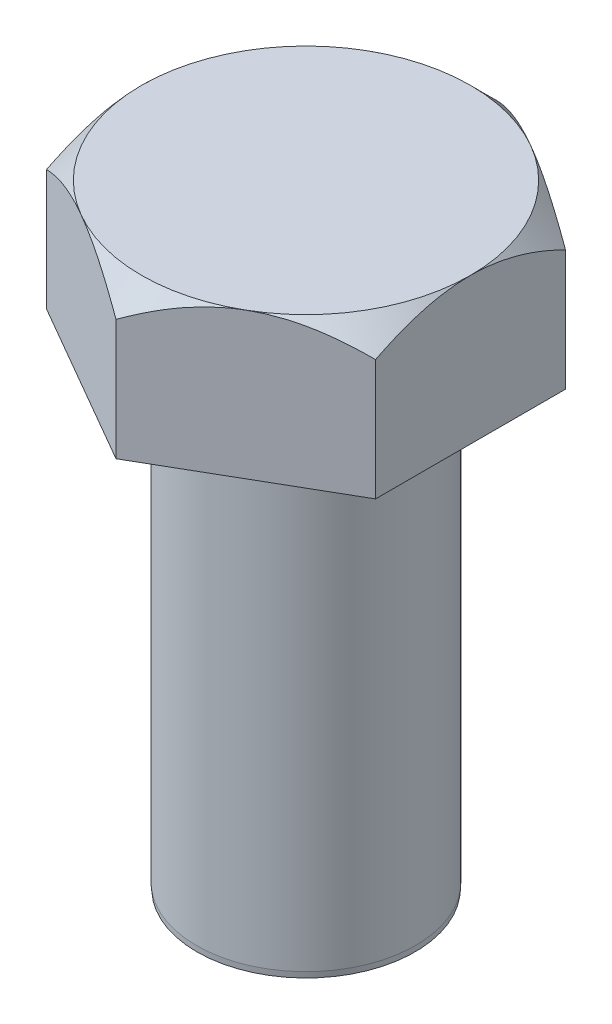
ISO-10303-21;
HEADER;
FILE_DESCRIPTION(('STEP AP214'),'2;1');
FILE_NAME('part.step','',(''),(''),'','','');
FILE_SCHEMA(('AUTOMOTIVE_DESIGN { 1 0 10303 214 1 1 1 1 }'));
ENDSEC;
DATA;
#1=APPLICATION_CONTEXT('core data for automotive mechanical design processes');
#2=APPLICATION_PROTOCOL_DEFINITION('international standard','automotive_design',2000,#1);
#3=PRODUCT_CONTEXT('',#1,'mechanical');
#4=PRODUCT('Part','Part','',(#3));
#5=PRODUCT_RELATED_PRODUCT_CATEGORY('part','',(#4));
#6=PRODUCT_DEFINITION_FORMATION('','',#4);
#7=PRODUCT_DEFINITION_CONTEXT('part definition',#1,'design');
#8=PRODUCT_DEFINITION('design','',#6,#7);
#9=PRODUCT_DEFINITION_SHAPE('','',#8);
#10=(LENGTH_UNIT() NAMED_UNIT(*) SI_UNIT(.MILLI.,.METRE.));
#11=(NAMED_UNIT(*) PLANE_ANGLE_UNIT() SI_UNIT($,.RADIAN.));
#12=(NAMED_UNIT(*) SI_UNIT($,.STERADIAN.) SOLID_ANGLE_UNIT());
#13=UNCERTAINTY_MEASURE_WITH_UNIT(LENGTH_MEASURE(1.E-05),#10,'distance_accuracy_value','');
#14=(GEOMETRIC_REPRESENTATION_CONTEXT(3) GLOBAL_UNCERTAINTY_ASSIGNED_CONTEXT((#13)) GLOBAL_UNIT_ASSIGNED_CONTEXT((#10,
#11,#12)) REPRESENTATION_CONTEXT('',''));
#15=CARTESIAN_POINT('',(0.,0.,0.));
#16=DIRECTION('',(0.,0.,1.));
#17=DIRECTION('',(1.,0.,0.));
#18=AXIS2_PLACEMENT_3D('',#15,#16,#17);
#19=CARTESIAN_POINT('',(7.15009999999996,6.35,-4.12811215973283));
#20=DIRECTION('',(-0.499999999999995,0.,0.866025403784441));
#21=DIRECTION('',(0.866025403784442,0.,0.499999999999995));
#22=AXIS2_PLACEMENT_3D('',#19,#20,#21);
#23=PLANE('',#22);
#24=CARTESIAN_POINT('',(7.15029999999996,5.24376020805829,-4.12799668967899));
#25=CARTESIAN_POINT('',(7.02735981479973,5.31473208114426,-4.19897623869856));
#26=CARTESIAN_POINT('',(6.90347465758507,5.38352591509957,-4.27050136756504));
#27=CARTESIAN_POINT('',(6.65362901516201,5.51609496244518,-4.41474981647385));
#28=CARTESIAN_POINT('',(6.52766744128796,5.57986743492815,-4.48747376505758));
#29=CARTESIAN_POINT('',(6.14521985336649,5.76320280111308,-4.70827998289497));
#30=CARTESIAN_POINT('',(5.88549626774101,5.87400155292641,-4.85823146497073));
#31=CARTESIAN_POINT('',(5.36174291484116,6.06373669034418,-5.16062060425642));
#32=CARTESIAN_POINT('',(5.09784700922402,6.14315107326227,-5.31298097640252));
#33=CARTESIAN_POINT('',(4.69766469893423,6.23501393674774,-5.54402634097325));
#34=CARTESIAN_POINT('',(4.56368142899528,6.26107948825729,-5.62138161793941));
#35=CARTESIAN_POINT('',(4.29458046497126,6.30353452510466,-5.77674713195786));
#36=CARTESIAN_POINT('',(4.15946294347778,6.319925456437,-5.85475726936435));
#37=CARTESIAN_POINT('',(3.83019852397778,6.34740730224126,-6.04485817059725));
#38=CARTESIAN_POINT('',(3.63569685436158,6.35317340265754,-6.15715376190799));
#39=CARTESIAN_POINT('',(3.24704409240871,6.34349459202812,-6.38154253864277));
#40=CARTESIAN_POINT('',(3.05289314684432,6.32804224579773,-6.49363563932778));
#41=CARTESIAN_POINT('',(2.66642169813378,6.27683739902505,-6.71676503427492));
#42=CARTESIAN_POINT('',(2.47410348685935,6.24106219749936,-6.82780000532428));
#43=CARTESIAN_POINT('',(2.09277255135678,6.15115660179108,-7.04796152358701));
#44=CARTESIAN_POINT('',(1.90375957482909,6.09702761510223,-7.15708821646561));
#45=CARTESIAN_POINT('',(1.56823093998172,5.98566881448239,-7.35080576411556));
#46=CARTESIAN_POINT('',(1.42097225552798,5.93136793728872,-7.43582560522543));
#47=CARTESIAN_POINT('',(1.12909829468736,5.81401595028394,-7.6043391150862));
#48=CARTESIAN_POINT('',(0.984483098549458,5.75096457532957,-7.68783273750533));
#49=CARTESIAN_POINT('',(0.6983516080155,5.61752492778284,-7.85303083058874));
#50=CARTESIAN_POINT('',(0.55682717595113,5.54715972840591,-7.93473999953801));
#51=CARTESIAN_POINT('',(0.276398890261677,5.40001620595466,-8.0966453457692));
#52=CARTESIAN_POINT('',(0.137493492810105,5.32324181558632,-8.17684241437976));
#53=CARTESIAN_POINT('',(-0.000199999999999894,5.24376020805829,-8.25633978951933));
#54=B_SPLINE_CURVE_WITH_KNOTS('',3,(#24,#25,#26,#27,#28,#29,#30,#31,#32,#33,#34,#35,#36,#37,#38,
#39,#40,#41,#42,#43,#44,#45,#46,#47,#48,#49,#50,#51,#52,#53),.UNSPECIFIED.,.F.,.F.,(4,2,2,2,2,2,
2,2,2,2,2,2,2,2,4),(0.,0.476107132166216,0.952472371030046,1.91034566100054,2.85300915505907,
3.32341643946382,3.7937533977268,4.46670173744884,5.13988594609707,5.81382359601269,
6.48770957546597,7.02295690652281,7.55822045931063,8.09184389327706,8.6251422671035),.UNSPECIFIED.);
#55=CARTESIAN_POINT('',(7.15009999999996,5.24387568053451,-4.12811215973283));
#56=VERTEX_POINT('',#55);
#57=CARTESIAN_POINT('',(3.57504999999996,6.35,-6.19216823959914));
#58=VERTEX_POINT('',#57);
#59=EDGE_CURVE('E105',#56,#58,#54,.T.);
#60=ORIENTED_EDGE('',*,*,#59,.F.);
#61=DIRECTION('',(0.,-1.,0.));
#62=VECTOR('',#61,1.);
#63=CARTESIAN_POINT('',(7.15009999999996,6.35,-4.12811215973283));
#64=LINE('',#63,#62);
#65=CARTESIAN_POINT('',(7.15009999999996,0.,-4.12811215973283));
#66=VERTEX_POINT('',#65);
#67=EDGE_CURVE('E272',#56,#66,#64,.T.);
#68=ORIENTED_EDGE('',*,*,#67,.T.);
#69=DIRECTION('',(-0.866025403784441,0.,-0.499999999999995));
#70=VECTOR('',#69,1.);
#71=CARTESIAN_POINT('',(7.15009999999996,0.,-4.12811215973283));
#72=LINE('',#71,#70);
#73=CARTESIAN_POINT('',(0.,0.,-8.25622431946549));
#74=VERTEX_POINT('',#73);
#75=EDGE_CURVE('E114',#66,#74,#72,.T.);
#76=ORIENTED_EDGE('',*,*,#75,.T.);
#77=DIRECTION('',(0.,-1.,0.));
#78=VECTOR('',#77,1.);
#79=CARTESIAN_POINT('',(0.,6.35,-8.25622431946549));
#80=LINE('',#79,#78);
#81=CARTESIAN_POINT('',(0.,5.24387568053451,-8.25622431946549));
#82=VERTEX_POINT('',#81);
#83=EDGE_CURVE('E132',#82,#74,#80,.T.);
#84=ORIENTED_EDGE('',*,*,#83,.F.);
#85=EDGE_CURVE('E115',#58,#82,#54,.T.);
#86=ORIENTED_EDGE('',*,*,#85,.F.);
#87=EDGE_LOOP('',(#60,#68,#76,#84,#86));
#88=FACE_BOUND('',#87,.T.);
#89=ADVANCED_FACE('F35',(#88),#23,.F.);
#90=CARTESIAN_POINT('',(0.,6.35,-8.25622431946549));
#91=DIRECTION('',(0.500000000000001,0.,0.866025403784438));
#92=DIRECTION('',(0.866025403784438,0.,-0.500000000000001));
#93=AXIS2_PLACEMENT_3D('',#90,#91,#92);
#94=PLANE('',#93);
#95=CARTESIAN_POINT('',(0.0002,5.24376020805829,-8.25633978951933));
#96=CARTESIAN_POINT('',(-0.122740185200222,5.31473208114426,-8.18536024049976));
#97=CARTESIAN_POINT('',(-0.246625342414885,5.38352591509958,-8.11383511163327));
#98=CARTESIAN_POINT('',(-0.496470984837945,5.51609496244519,-7.96958666272447));
#99=CARTESIAN_POINT('',(-0.622432558711996,5.57986743492816,-7.89686271414073));
#100=CARTESIAN_POINT('',(-1.00488014663348,5.76320280111309,-7.67605649630334));
#101=CARTESIAN_POINT('',(-1.26460373225895,5.87400155292642,-7.52610501422758));
#102=CARTESIAN_POINT('',(-1.78835708515881,6.06373669034419,-7.22371587494188));
#103=CARTESIAN_POINT('',(-2.05225299077595,6.1431510732623,-7.07135550279578));
#104=CARTESIAN_POINT('',(-2.45243530106574,6.23501393674777,-6.84031013822504));
#105=CARTESIAN_POINT('',(-2.58641857100469,6.26107948825732,-6.76295486125888));
#106=CARTESIAN_POINT('',(-2.85551953502872,6.30353452510469,-6.60758934724042));
#107=CARTESIAN_POINT('',(-2.99063705652219,6.31992545643702,-6.52957920983393));
#108=CARTESIAN_POINT('',(-3.3199014760222,6.34740730224129,-6.33947830860103));
#109=CARTESIAN_POINT('',(-3.51440314563839,6.35317340265757,-6.22718271729029));
#110=CARTESIAN_POINT('',(-3.90305590759126,6.34349459202815,-6.00279394055551));
#111=CARTESIAN_POINT('',(-4.09720685315564,6.32804224579776,-5.89070083987049));
#112=CARTESIAN_POINT('',(-4.48367830186619,6.27683739902508,-5.66757144492336));
#113=CARTESIAN_POINT('',(-4.67599651314062,6.24106219749939,-5.556536473874));
#114=CARTESIAN_POINT('',(-5.05732744864318,6.15115660179112,-5.33637495561126));
#115=CARTESIAN_POINT('',(-5.24634042517087,6.09702761510226,-5.22724826273266));
#116=CARTESIAN_POINT('',(-5.58186906001824,5.98566881448243,-5.03353071508271));
#117=CARTESIAN_POINT('',(-5.72912774447198,5.93136793728875,-4.94851087397283));
#118=CARTESIAN_POINT('',(-6.02100170531261,5.81401595028396,-4.77999736411205));
#119=CARTESIAN_POINT('',(-6.16561690145052,5.7509645753296,-4.69650374169292));
#120=CARTESIAN_POINT('',(-6.45174839198449,5.61752492778286,-4.5313056486095));
#121=CARTESIAN_POINT('',(-6.59327282404887,5.54715972840593,-4.44959647966022));
#122=CARTESIAN_POINT('',(-6.87370110973833,5.40001620595466,-4.28769113342903));
#123=CARTESIAN_POINT('',(-7.0126065071899,5.32324181558632,-4.20749406481847));
#124=CARTESIAN_POINT('',(-7.15030000000001,5.24376020805829,-4.12799668967889));
#125=B_SPLINE_CURVE_WITH_KNOTS('',3,(#95,#96,#97,#98,#99,#100,#101,#102,#103,#104,#105,#106,
#107,#108,#109,#110,#111,#112,#113,#114,#115,#116,#117,#118,#119,#120,#121,#122,#123,#124),
.UNSPECIFIED.,.F.,.F.,(4,2,2,2,2,2,2,2,2,2,2,2,2,2,4),(0.,0.476107132166221,0.952472371030056,
1.91034566100056,2.85300915505911,3.32341643946385,3.79375339772684,4.46670173744889,
5.13988594609711,5.81382359601273,6.48770957546601,7.02295690652286,7.55822045931071,
8.09184389327715,8.62514226710361),.UNSPECIFIED.);
#126=CARTESIAN_POINT('',(-3.57505000000001,6.35,-6.19216823959911));
#127=VERTEX_POINT('',#126);
#128=EDGE_CURVE('E122',#82,#127,#125,.T.);
#129=ORIENTED_EDGE('',*,*,#128,.F.);
#130=ORIENTED_EDGE('',*,*,#83,.T.);
#131=DIRECTION('',(-0.866025403784438,0.,0.500000000000001));
#132=VECTOR('',#131,1.);
#133=CARTESIAN_POINT('',(0.,0.,-8.25622431946549));
#134=LINE('',#133,#132);
#135=CARTESIAN_POINT('',(-7.15010000000001,0.,-4.12811215973273));
#136=VERTEX_POINT('',#135);
#137=EDGE_CURVE('E263',#74,#136,#134,.T.);
#138=ORIENTED_EDGE('',*,*,#137,.T.);
#139=DIRECTION('',(0.,-1.,0.));
#140=VECTOR('',#139,1.);
#141=CARTESIAN_POINT('',(-7.15010000000001,6.35,-4.12811215973273));
#142=LINE('',#141,#140);
#143=CARTESIAN_POINT('',(-7.15010000000001,5.24387568053451,-4.12811215973273));
#144=VERTEX_POINT('',#143);
#145=EDGE_CURVE('E205',#144,#136,#142,.T.);
#146=ORIENTED_EDGE('',*,*,#145,.F.);
#147=EDGE_CURVE('E133',#127,#144,#125,.T.);
#148=ORIENTED_EDGE('',*,*,#147,.F.);
#149=EDGE_LOOP('',(#129,#130,#138,#146,#148));
#150=FACE_BOUND('',#149,.T.);
#151=ADVANCED_FACE('F193',(#150),#94,.F.);
#152=CARTESIAN_POINT('',(-7.15010000000001,6.35,-4.12811215973273));
#153=DIRECTION('',(1.,0.,0.));
#154=DIRECTION('',(0.,0.,-1.));
#155=AXIS2_PLACEMENT_3D('',#152,#153,#154);
#156=PLANE('',#155);
#157=CARTESIAN_POINT('',(-7.15010000000003,1.63089085788719,-9.47386909605649));
#158=CARTESIAN_POINT('',(-7.15010000000003,1.81121581560539,-9.24790249070521));
#159=CARTESIAN_POINT('',(-7.15010000000003,1.99016418725543,-9.02082114931031));
#160=CARTESIAN_POINT('',(-7.15010000000003,2.34465316669975,-8.56394073706759));
#161=CARTESIAN_POINT('',(-7.15010000000003,2.5201930563962,-8.33414110959574));
#162=CARTESIAN_POINT('',(-7.15010000000003,2.868446395647,-7.86968034981608));
#163=CARTESIAN_POINT('',(-7.15010000000003,3.0411284373893,-7.63499559658916));
#164=CARTESIAN_POINT('',(-7.15010000000002,3.38131039804522,-7.16191403046406));
#165=CARTESIAN_POINT('',(-7.15010000000002,3.54881066036877,-6.92351746513816));
#166=CARTESIAN_POINT('',(-7.15010000000002,3.89019859321875,-6.42356671095031));
#167=CARTESIAN_POINT('',(-7.15010000000002,4.06356649358224,-6.16165586234294));
#168=CARTESIAN_POINT('',(-7.15010000000002,4.40077381694092,-5.63166319550724));
#169=CARTESIAN_POINT('',(-7.15010000000002,4.56461143837196,-5.36358022380933));
#170=CARTESIAN_POINT('',(-7.15010000000002,4.87937516438839,-4.82096243326766));
#171=CARTESIAN_POINT('',(-7.15010000000002,5.03033869234989,-4.54644949317194));
#172=CARTESIAN_POINT('',(-7.15010000000001,5.31597281014485,-3.98913965325442));
#173=CARTESIAN_POINT('',(-7.15010000000001,5.45065169434768,-3.70634706251455));
#174=CARTESIAN_POINT('',(-7.15010000000001,5.68224395499392,-3.16946720873966));
#175=CARTESIAN_POINT('',(-7.15010000000001,5.78179628197522,-2.91652981738955));
#176=CARTESIAN_POINT('',(-7.15010000000001,5.96068130805078,-2.40346766112692));
#177=CARTESIAN_POINT('',(-7.15010000000001,6.04001286165642,-2.14334248995796));
#178=CARTESIAN_POINT('',(-7.1501,6.17245096820923,-1.62248495464225));
#179=CARTESIAN_POINT('',(-7.1501,6.22609680418521,-1.36189223637387));
#180=CARTESIAN_POINT('',(-7.1501,6.30590762943054,-0.836507861915944));
#181=CARTESIAN_POINT('',(-7.1501,6.33208104018206,-0.571717517759924));
#182=CARTESIAN_POINT('',(-7.1501,6.35408284405149,-0.0577187353176461));
#183=CARTESIAN_POINT('',(-7.1501,6.35173239837544,0.19141159314656));
#184=CARTESIAN_POINT('',(-7.1501,6.32124800606946,0.688077635906895));
#185=CARTESIAN_POINT('',(-7.1501,6.29311214694111,0.935613230550542));
#186=CARTESIAN_POINT('',(-7.15009999999999,6.21229082442829,1.43154670462864));
#187=CARTESIAN_POINT('',(-7.15009999999999,6.15913527095504,1.6798664946589));
#188=CARTESIAN_POINT('',(-7.15009999999999,6.03147971556139,2.17085918647798));
#189=CARTESIAN_POINT('',(-7.15009999999999,5.9569795257941,2.4135320385497));
#190=CARTESIAN_POINT('',(-7.15009999999999,5.79048248965085,2.89215321636684));
#191=CARTESIAN_POINT('',(-7.15009999999999,5.69852189244993,3.12811432942166));
#192=CARTESIAN_POINT('',(-7.15009999999999,5.50032506783947,3.59401612680425));
#193=CARTESIAN_POINT('',(-7.15009999999999,5.39408271156479,3.8239541754974));
#194=CARTESIAN_POINT('',(-7.15009999999998,5.16984050461004,4.27885242834733));
#195=CARTESIAN_POINT('',(-7.15009999999998,5.05180562125056,4.50379521875785));
#196=CARTESIAN_POINT('',(-7.15009999999998,4.80656023664318,4.94854616944678));
#197=CARTESIAN_POINT('',(-7.15009999999998,4.67935108776111,5.168355080205));
#198=CARTESIAN_POINT('',(-7.15009999999998,4.42401096856745,5.59273981639913));
#199=CARTESIAN_POINT('',(-7.15009999999998,4.29623669089792,5.79753139755686));
#200=CARTESIAN_POINT('',(-7.15009999999998,4.03519862932643,6.20359582585859));
#201=CARTESIAN_POINT('',(-7.15009999999998,3.90193444245225,6.4048684131501));
#202=CARTESIAN_POINT('',(-7.15009999999998,3.63195773249821,6.80275896707806));
#203=CARTESIAN_POINT('',(-7.15009999999998,3.49528075722348,6.9994011408559));
#204=CARTESIAN_POINT('',(-7.15009999999997,3.21822330604325,7.38998078224734));
#205=CARTESIAN_POINT('',(-7.15009999999997,3.0778438588743,7.58391897874123));
#206=CARTESIAN_POINT('',(-7.15009999999997,2.93594735354651,7.77672110388246));
#207=B_SPLINE_CURVE_WITH_KNOTS('',3,(#157,#158,#159,#160,#161,#162,#163,#164,#165,#166,#167,
#168,#169,#170,#171,#172,#173,#174,#175,#176,#177,#178,#179,#180,#181,#182,#183,#184,#185,#186,
#187,#188,#189,#190,#191,#192,#193,#194,#195,#196,#197,#198,#199,#200,#201,#202,#203,#204,#205,
#206),.UNSPECIFIED.,.F.,.F.,(4,2,2,2,2,2,2,2,2,2,2,2,2,2,2,2,2,2,2,2,2,2,2,2,4),(0.,
0.867309176171177,1.73479913643537,2.60884845848508,3.48283973039317,4.42495432930787,
5.36724644671029,6.30669878036595,7.24567058249782,8.06046150623437,8.87529857688988,
9.67218308312768,10.4688232385201,11.214882925787,11.9609979526155,12.7217281313764,
13.4824650052708,14.2416394652586,15.0011407631884,15.7629695239043,16.524686213128,
17.248733545678,17.9728341200296,18.6912157430264,19.4093998229271),.UNSPECIFIED.);
#208=CARTESIAN_POINT('',(-7.1501,6.35,0.));
#209=VERTEX_POINT('',#208);
#210=EDGE_CURVE('E187',#144,#209,#207,.T.);
#211=ORIENTED_EDGE('',*,*,#210,.F.);
#212=ORIENTED_EDGE('',*,*,#145,.T.);
#213=DIRECTION('',(0.,0.,1.));
#214=VECTOR('',#213,1.);
#215=CARTESIAN_POINT('',(-7.15010000000001,0.,-4.12811215973273));
#216=LINE('',#215,#214);
#217=CARTESIAN_POINT('',(-7.15009999999999,0.,4.12811215973278));
#218=VERTEX_POINT('',#217);
#219=EDGE_CURVE('E222',#136,#218,#216,.T.);
#220=ORIENTED_EDGE('',*,*,#219,.T.);
#221=DIRECTION('',(0.,-1.,0.));
#222=VECTOR('',#221,1.);
#223=CARTESIAN_POINT('',(-7.15009999999999,6.35,4.12811215973278));
#224=LINE('',#223,#222);
#225=CARTESIAN_POINT('',(-7.15009999999999,5.24387568053451,4.12811215973278));
#226=VERTEX_POINT('',#225);
#227=EDGE_CURVE('E220',#226,#218,#224,.T.);
#228=ORIENTED_EDGE('',*,*,#227,.F.);
#229=EDGE_CURVE('E181',#209,#226,#207,.T.);
#230=ORIENTED_EDGE('',*,*,#229,.F.);
#231=EDGE_LOOP('',(#211,#212,#220,#228,#230));
#232=FACE_BOUND('',#231,.T.);
#233=ADVANCED_FACE('F189',(#232),#156,.F.);
#234=CARTESIAN_POINT('',(-7.15009999999999,6.35,4.12811215973278));
#235=DIRECTION('',(0.499999999999995,0.,-0.866025403784441));
#236=DIRECTION('',(-0.866025403784441,0.,-0.499999999999995));
#237=AXIS2_PLACEMENT_3D('',#234,#235,#236);
#238=PLANE('',#237);
#239=CARTESIAN_POINT('',(-7.15029999999998,5.24376020805829,4.12799668967894));
#240=CARTESIAN_POINT('',(-7.02735981479976,5.31473208114426,4.19897623869851));
#241=CARTESIAN_POINT('',(-6.9034746575851,5.38352591509958,4.27050136756499));
#242=CARTESIAN_POINT('',(-6.65362901516204,5.51609496244519,4.4147498164738));
#243=CARTESIAN_POINT('',(-6.52766744128798,5.57986743492816,4.48747376505753));
#244=CARTESIAN_POINT('',(-6.1452198533665,5.76320280111309,4.70827998289492));
#245=CARTESIAN_POINT('',(-5.88549626774103,5.87400155292642,4.85823146497068));
#246=CARTESIAN_POINT('',(-5.36174291484117,6.06373669034419,5.16062060425638));
#247=CARTESIAN_POINT('',(-5.09784700922402,6.1431510732623,5.31298097640248));
#248=CARTESIAN_POINT('',(-4.69766469893423,6.23501393674777,5.54402634097321));
#249=CARTESIAN_POINT('',(-4.56368142899528,6.26107948825732,5.62138161793937));
#250=CARTESIAN_POINT('',(-4.29458046497126,6.30353452510469,5.77674713195783));
#251=CARTESIAN_POINT('',(-4.15946294347778,6.31992545643702,5.85475726936432));
#252=CARTESIAN_POINT('',(-3.83019852397777,6.34740730224129,6.04485817059721));
#253=CARTESIAN_POINT('',(-3.63569685436158,6.35317340265757,6.15715376190795));
#254=CARTESIAN_POINT('',(-3.24704409240871,6.34349459202815,6.38154253864273));
#255=CARTESIAN_POINT('',(-3.05289314684433,6.32804224579776,6.49363563932775));
#256=CARTESIAN_POINT('',(-2.66642169813378,6.27683739902508,6.71676503427488));
#257=CARTESIAN_POINT('',(-2.47410348685935,6.24106219749939,6.82780000532424));
#258=CARTESIAN_POINT('',(-2.09277255135678,6.15115660179112,7.04796152358698));
#259=CARTESIAN_POINT('',(-1.90375957482909,6.09702761510226,7.15708821646557));
#260=CARTESIAN_POINT('',(-1.56823093998172,5.98566881448243,7.35080576411552));
#261=CARTESIAN_POINT('',(-1.42097225552798,5.93136793728875,7.4358256052254));
#262=CARTESIAN_POINT('',(-1.12909829468735,5.81401595028396,7.60433911508618));
#263=CARTESIAN_POINT('',(-0.984483098549436,5.7509645753296,7.68783273750531));
#264=CARTESIAN_POINT('',(-0.698351608015466,5.61752492778286,7.85303083058873));
#265=CARTESIAN_POINT('',(-0.556827175951092,5.54715972840593,7.934739999538));
#266=CARTESIAN_POINT('',(-0.276398890261629,5.40001620595466,8.0966453457692));
#267=CARTESIAN_POINT('',(-0.137493492810052,5.32324181558632,8.17684241437975));
#268=CARTESIAN_POINT('',(0.000200000000057124,5.24376020805829,8.25633978951933));
#269=B_SPLINE_CURVE_WITH_KNOTS('',3,(#239,#240,#241,#242,#243,#244,#245,#246,#247,#248,#249,
#250,#251,#252,#253,#254,#255,#256,#257,#258,#259,#260,#261,#262,#263,#264,#265,#266,#267,#268),
.UNSPECIFIED.,.F.,.F.,(4,2,2,2,2,2,2,2,2,2,2,2,2,2,4),(0.,0.476107132166221,0.952472371030058,
1.91034566100057,2.85300915505911,3.32341643946385,3.79375339772684,4.46670173744888,
5.13988594609711,5.81382359601273,6.48770957546601,7.02295690652286,7.55822045931071,
8.09184389327715,8.62514226710361),.UNSPECIFIED.);
#270=CARTESIAN_POINT('',(-3.57504999999996,6.35,6.19216823959913));
#271=VERTEX_POINT('',#270);
#272=EDGE_CURVE('E188',#226,#271,#269,.T.);
#273=ORIENTED_EDGE('',*,*,#272,.F.);
#274=ORIENTED_EDGE('',*,*,#227,.T.);
#275=DIRECTION('',(0.866025403784441,0.,0.499999999999995));
#276=VECTOR('',#275,1.);
#277=CARTESIAN_POINT('',(-7.15009999999999,0.,4.12811215973278));
#278=LINE('',#277,#276);
#279=CARTESIAN_POINT('',(0.,0.,8.25622431946549));
#280=VERTEX_POINT('',#279);
#281=EDGE_CURVE('E264',#218,#280,#278,.T.);
#282=ORIENTED_EDGE('',*,*,#281,.T.);
#283=DIRECTION('',(0.,-1.,0.));
#284=VECTOR('',#283,1.);
#285=CARTESIAN_POINT('',(0.,6.35,8.25622431946549));
#286=LINE('',#285,#284);
#287=CARTESIAN_POINT('',(0.,5.24387568053451,8.25622431946549));
#288=VERTEX_POINT('',#287);
#289=EDGE_CURVE('E226',#288,#280,#286,.T.);
#290=ORIENTED_EDGE('',*,*,#289,.F.);
#291=EDGE_CURVE('E175',#271,#288,#269,.T.);
#292=ORIENTED_EDGE('',*,*,#291,.F.);
#293=EDGE_LOOP('',(#273,#274,#282,#290,#292));
#294=FACE_BOUND('',#293,.T.);
#295=ADVANCED_FACE('F192',(#294),#238,.F.);
#296=CARTESIAN_POINT('',(0.,6.35,8.25622431946549));
#297=DIRECTION('',(-0.500000000000007,0.,-0.866025403784435));
#298=DIRECTION('',(-0.866025403784435,0.,0.500000000000007));
#299=AXIS2_PLACEMENT_3D('',#296,#297,#298);
#300=PLANE('',#299);
#301=CARTESIAN_POINT('',(-0.000199999999942347,5.24376020805829,8.25633978951933));
#302=CARTESIAN_POINT('',(0.122740185200279,5.31473208114426,8.18536024049976));
#303=CARTESIAN_POINT('',(0.246625342414941,5.38352591509958,8.11383511163327));
#304=CARTESIAN_POINT('',(0.496470984838001,5.51609496244519,7.96958666272446));
#305=CARTESIAN_POINT('',(0.622432558712051,5.57986743492816,7.89686271414073));
#306=CARTESIAN_POINT('',(1.00488014663353,5.76320280111309,7.67605649630334));
#307=CARTESIAN_POINT('',(1.264603732259,5.87400155292642,7.52610501422757));
#308=CARTESIAN_POINT('',(1.78835708515886,6.06373669034419,7.22371587494186));
#309=CARTESIAN_POINT('',(2.052252990776,6.1431510732623,7.07135550279576));
#310=CARTESIAN_POINT('',(2.45243530106579,6.23501393674777,6.84031013822502));
#311=CARTESIAN_POINT('',(2.58641857100474,6.26107948825731,6.76295486125886));
#312=CARTESIAN_POINT('',(2.85551953502876,6.30353452510469,6.6075893472404));
#313=CARTESIAN_POINT('',(2.99063705652223,6.31992545643702,6.52957920983391));
#314=CARTESIAN_POINT('',(3.31990147602224,6.34740730224129,6.33947830860101));
#315=CARTESIAN_POINT('',(3.51440314563843,6.35317340265757,6.22718271729027));
#316=CARTESIAN_POINT('',(3.9030559075913,6.34349459202815,6.00279394055549));
#317=CARTESIAN_POINT('',(4.09720685315568,6.32804224579776,5.89070083987047));
#318=CARTESIAN_POINT('',(4.48367830186623,6.27683739902508,5.66757144492333));
#319=CARTESIAN_POINT('',(4.67599651314065,6.24106219749939,5.55653647387397));
#320=CARTESIAN_POINT('',(5.05732744864322,6.15115660179112,5.33637495561122));
#321=CARTESIAN_POINT('',(5.24634042517091,6.09702761510226,5.22724826273263));
#322=CARTESIAN_POINT('',(5.58186906001828,5.98566881448243,5.03353071508267));
#323=CARTESIAN_POINT('',(5.72912774447202,5.93136793728875,4.94851087397279));
#324=CARTESIAN_POINT('',(6.02100170531265,5.81401595028396,4.77999736411201));
#325=CARTESIAN_POINT('',(6.16561690145056,5.7509645753296,4.69650374169287));
#326=CARTESIAN_POINT('',(6.45174839198452,5.61752492778285,4.53130564860946));
#327=CARTESIAN_POINT('',(6.5932728240489,5.54715972840592,4.44959647966018));
#328=CARTESIAN_POINT('',(6.87370110973836,5.40001620595466,4.28769113342898));
#329=CARTESIAN_POINT('',(7.01260650718993,5.32324181558632,4.20749406481842));
#330=CARTESIAN_POINT('',(7.15030000000004,5.24376020805829,4.12799668967884));
#331=B_SPLINE_CURVE_WITH_KNOTS('',3,(#301,#302,#303,#304,#305,#306,#307,#308,#309,#310,#311,
#312,#313,#314,#315,#316,#317,#318,#319,#320,#321,#322,#323,#324,#325,#326,#327,#328,#329,#330),
.UNSPECIFIED.,.F.,.F.,(4,2,2,2,2,2,2,2,2,2,2,2,2,2,4),(0.,0.476107132166222,0.952472371030056,
1.91034566100056,2.8530091550591,3.32341643946385,3.79375339772684,4.46670173744888,
5.13988594609711,5.81382359601273,6.48770957546601,7.02295690652286,7.55822045931071,
8.09184389327715,8.62514226710361),.UNSPECIFIED.);
#332=CARTESIAN_POINT('',(3.57505000000005,6.35,6.19216823959909));
#333=VERTEX_POINT('',#332);
#334=EDGE_CURVE('E283',#288,#333,#331,.T.);
#335=ORIENTED_EDGE('',*,*,#334,.F.);
#336=ORIENTED_EDGE('',*,*,#289,.T.);
#337=DIRECTION('',(0.866025403784435,0.,-0.500000000000007));
#338=VECTOR('',#337,1.);
#339=CARTESIAN_POINT('',(0.,0.,8.25622431946549));
#340=LINE('',#339,#338);
#341=CARTESIAN_POINT('',(7.15010000000004,0.,4.12811215973268));
#342=VERTEX_POINT('',#341);
#343=EDGE_CURVE('E268',#280,#342,#340,.T.);
#344=ORIENTED_EDGE('',*,*,#343,.T.);
#345=DIRECTION('',(0.,-1.,0.));
#346=VECTOR('',#345,1.);
#347=CARTESIAN_POINT('',(7.15010000000004,6.35,4.12811215973268));
#348=LINE('',#347,#346);
#349=CARTESIAN_POINT('',(7.15010000000004,5.24387568053451,4.12811215973268));
#350=VERTEX_POINT('',#349);
#351=EDGE_CURVE('E229',#350,#342,#348,.T.);
#352=ORIENTED_EDGE('',*,*,#351,.F.);
#353=EDGE_CURVE('E168',#333,#350,#331,.T.);
#354=ORIENTED_EDGE('',*,*,#353,.F.);
#355=EDGE_LOOP('',(#335,#336,#344,#352,#354));
#356=FACE_BOUND('',#355,.T.);
#357=ADVANCED_FACE('F280',(#356),#300,.F.);
#358=CARTESIAN_POINT('',(7.15010000000004,6.35,4.12811215973268));
#359=DIRECTION('',(-1.,0.,0.));
#360=DIRECTION('',(0.,0.,1.));
#361=AXIS2_PLACEMENT_3D('',#358,#359,#360);
#362=PLANE('',#361);
#363=CARTESIAN_POINT('',(7.1500999999999,1.63089084568141,-9.47386911134843));
#364=CARTESIAN_POINT('',(7.1500999999999,1.8112158038748,-9.24790250553399));
#365=CARTESIAN_POINT('',(7.15009999999991,1.9901641759994,-9.02082116367475));
#366=CARTESIAN_POINT('',(7.15009999999991,2.34465315639033,-8.56394075049952));
#367=CARTESIAN_POINT('',(7.15009999999991,2.52019304655884,-8.33414112255949));
#368=CARTESIAN_POINT('',(7.15009999999992,2.86844638675769,-7.86968036182892));
#369=CARTESIAN_POINT('',(7.15009999999992,3.04112842897584,-7.63499560811917));
#370=CARTESIAN_POINT('',(7.15009999999992,3.38131039057672,-7.16191404102097));
#371=CARTESIAN_POINT('',(7.15009999999993,3.54881065336935,-6.92351747520483));
#372=CARTESIAN_POINT('',(7.15009999999993,3.89019858720553,-6.42356671995492));
#373=CARTESIAN_POINT('',(7.15009999999994,4.06356648808435,-6.16165587077427));
#374=CARTESIAN_POINT('',(7.15009999999994,4.40077381245204,-5.63166320277258));
#375=CARTESIAN_POINT('',(7.15009999999994,4.56461143437675,-5.36358023048195));
#376=CARTESIAN_POINT('',(7.15009999999995,4.87937516134173,-4.82096243873408));
#377=CARTESIAN_POINT('',(7.15009999999995,5.03033868975839,-4.54644949802505));
#378=CARTESIAN_POINT('',(7.15009999999996,5.31597280840798,-3.98913965684663));
#379=CARTESIAN_POINT('',(7.15009999999996,5.45065169301035,-3.7063470654592));
#380=CARTESIAN_POINT('',(7.15009999999997,5.68224395389446,-3.16946721142345));
#381=CARTESIAN_POINT('',(7.15009999999997,5.7817962807887,-2.91652982049303));
#382=CARTESIAN_POINT('',(7.15009999999997,5.96068130677324,-2.40346766509055));
#383=CARTESIAN_POINT('',(7.15009999999998,6.04001286037489,-2.14334249436203));
#384=CARTESIAN_POINT('',(7.15009999999998,6.17245096702639,-1.62248495991549));
#385=CARTESIAN_POINT('',(7.15009999999999,6.22609680310152,-1.36189224207524));
#386=CARTESIAN_POINT('',(7.15009999999999,6.30590762865255,-0.836507868466953));
#387=CARTESIAN_POINT('',(7.15009999999999,6.33208103961055,-0.571717524732427));
#388=CARTESIAN_POINT('',(7.1501,6.35408284398224,-0.057718742911977));
#389=CARTESIAN_POINT('',(7.1501,6.35173239857837,0.191411585350977));
#390=CARTESIAN_POINT('',(7.15010000000001,6.32124800684642,0.688077627739453));
#391=CARTESIAN_POINT('',(7.15010000000001,6.29311214801996,0.935613222212498));
#392=CARTESIAN_POINT('',(7.15010000000001,6.2122908261277,1.43154669595436));
#393=CARTESIAN_POINT('',(7.15010000000002,6.15913527297532,1.67986648581989));
#394=CARTESIAN_POINT('',(7.15010000000002,6.03147971821725,2.17085917733268));
#395=CARTESIAN_POINT('',(7.15010000000002,5.95697952876465,2.41353202926283));
#396=CARTESIAN_POINT('',(7.15010000000003,5.79048249349503,2.89215320606262));
#397=CARTESIAN_POINT('',(7.15010000000003,5.69852189690814,3.12811431826103));
#398=CARTESIAN_POINT('',(7.15010000000004,5.50032507358712,3.59401611397431));
#399=CARTESIAN_POINT('',(7.15010000000004,5.39408271798793,3.82395416185457));
#400=CARTESIAN_POINT('',(7.15010000000004,5.16984051242519,4.27885241310805));
#401=CARTESIAN_POINT('',(7.15010000000005,5.05180562978249,4.50379520273518));
#402=CARTESIAN_POINT('',(7.15010000000005,4.80656024663132,4.94854615188308));
#403=CARTESIAN_POINT('',(7.15010000000005,4.67935109848869,5.16835506188367));
#404=CARTESIAN_POINT('',(7.15010000000006,4.42401098069604,5.59273979670796));
#405=CARTESIAN_POINT('',(7.15010000000006,4.29623670368454,5.79753137725083));
#406=CARTESIAN_POINT('',(7.15010000000007,4.03519864343176,6.20359580433172));
#407=CARTESIAN_POINT('',(7.15010000000007,3.90193445721827,6.40486839101724));
#408=CARTESIAN_POINT('',(7.15010000000007,3.63195774857802,6.80275894374802));
#409=CARTESIAN_POINT('',(7.15010000000007,3.49528077395631,6.99940111693457));
#410=CARTESIAN_POINT('',(7.15010000000008,3.21822332408119,7.38998075714733));
#411=CARTESIAN_POINT('',(7.15010000000008,3.07784387756432,7.58391895305384));
#412=CARTESIAN_POINT('',(7.15010000000008,2.93594737288767,7.7767210776087));
#413=B_SPLINE_CURVE_WITH_KNOTS('',3,(#363,#364,#365,#366,#367,#368,#369,#370,#371,#372,#373,
#374,#375,#376,#377,#378,#379,#380,#381,#382,#383,#384,#385,#386,#387,#388,#389,#390,#391,#392,
#393,#394,#395,#396,#397,#398,#399,#400,#401,#402,#403,#404,#405,#406,#407,#408,#409,#410,#411,
#412),.UNSPECIFIED.,.F.,.F.,(4,2,2,2,2,2,2,2,2,2,2,2,2,2,2,2,2,2,2,2,2,2,2,2,4),(0.,
0.867309178146457,1.7347991403865,2.60884846444894,3.4828397383694,4.42495433957124,
5.36724645926233,6.30669879518682,7.24567059958342,8.06046152205712,8.87529859145194,
9.67218309649984,10.468823250704,11.2148829373626,11.9609979635813,12.7217281416573,
13.4824650148672,14.2416394717964,15.001140766664,15.7629695243005,16.524686210446,
17.248733540386,17.9728341121274,18.6912157325493,19.4093998098754),.UNSPECIFIED.);
#414=CARTESIAN_POINT('',(7.1501,6.35,0.));
#415=VERTEX_POINT('',#414);
#416=EDGE_CURVE('E276',#350,#415,#413,.F.);
#417=ORIENTED_EDGE('',*,*,#416,.F.);
#418=ORIENTED_EDGE('',*,*,#351,.T.);
#419=DIRECTION('',(0.,0.,-1.));
#420=VECTOR('',#419,1.);
#421=CARTESIAN_POINT('',(7.15010000000004,0.,4.12811215973268));
#422=LINE('',#421,#420);
#423=EDGE_CURVE('E262',#342,#66,#422,.T.);
#424=ORIENTED_EDGE('',*,*,#423,.T.);
#425=ORIENTED_EDGE('',*,*,#67,.F.);
#426=EDGE_CURVE('E110',#415,#56,#413,.F.);
#427=ORIENTED_EDGE('',*,*,#426,.F.);
#428=EDGE_LOOP('',(#417,#418,#424,#425,#427));
#429=FACE_BOUND('',#428,.T.);
#430=ADVANCED_FACE('F256',(#429),#362,.F.);
#431=CARTESIAN_POINT('',(0.,0.,0.));
#432=DIRECTION('',(0.,1.,0.));
#433=DIRECTION('',(0.,0.,1.));
#434=AXIS2_PLACEMENT_3D('',#431,#432,#433);
#435=PLANE('',#434);
#436=CARTESIAN_POINT('',(0.,0.,0.));
#437=DIRECTION('',(0.,1.,0.));
#438=DIRECTION('',(0.,0.,1.));
#439=AXIS2_PLACEMENT_3D('',#436,#437,#438);
#440=CIRCLE('',#439,4.7625);
#441=CARTESIAN_POINT('',(0.,0.,4.7625));
#442=VERTEX_POINT('',#441);
#443=EDGE_CURVE('E234',#442,#442,#440,.F.);
#444=ORIENTED_EDGE('',*,*,#443,.F.);
#445=EDGE_LOOP('',(#444));
#446=FACE_BOUND('',#445,.T.);
#447=ORIENTED_EDGE('',*,*,#75,.F.);
#448=ORIENTED_EDGE('',*,*,#423,.F.);
#449=ORIENTED_EDGE('',*,*,#343,.F.);
#450=ORIENTED_EDGE('',*,*,#281,.F.);
#451=ORIENTED_EDGE('',*,*,#219,.F.);
#452=ORIENTED_EDGE('',*,*,#137,.F.);
#453=EDGE_LOOP('',(#447,#448,#449,#450,#451,#452));
#454=FACE_BOUND('',#453,.T.);
#455=ADVANCED_FACE('F251',(#446,#454),#435,.F.);
#456=CARTESIAN_POINT('',(0.,-20.32,0.));
#457=DIRECTION('',(0.,1.,0.));
#458=DIRECTION('',(0.,0.,1.));
#459=AXIS2_PLACEMENT_3D('',#456,#457,#458);
#460=CYLINDRICAL_SURFACE('',#459,4.7625);
#461=CARTESIAN_POINT('',(0.,-20.0660000000002,0.));
#462=DIRECTION('',(0.,-1.,0.));
#463=DIRECTION('',(0.,0.,-1.));
#464=AXIS2_PLACEMENT_3D('',#461,#462,#463);
#465=CIRCLE('',#464,4.7625);
#466=CARTESIAN_POINT('',(0.,-20.0660000000002,-4.7625));
#467=VERTEX_POINT('',#466);
#468=EDGE_CURVE('E12',#467,#467,#465,.F.);
#469=ORIENTED_EDGE('',*,*,#468,.T.);
#470=EDGE_LOOP('',(#469));
#471=FACE_BOUND('',#470,.T.);
#472=ORIENTED_EDGE('',*,*,#443,.T.);
#473=EDGE_LOOP('',(#472));
#474=FACE_BOUND('',#473,.T.);
#475=ADVANCED_FACE('F248',(#471,#474),#460,.T.);
#476=CARTESIAN_POINT('',(0.,-20.32,0.));
#477=DIRECTION('',(0.,-1.,0.));
#478=DIRECTION('',(0.,0.,-1.));
#479=AXIS2_PLACEMENT_3D('',#476,#477,#478);
#480=PLANE('',#479);
#481=CARTESIAN_POINT('',(0.,-20.32,0.));
#482=DIRECTION('',(0.,-1.,0.));
#483=DIRECTION('',(0.,0.,-1.));
#484=AXIS2_PLACEMENT_3D('',#481,#482,#483);
#485=CIRCLE('',#484,4.74027787946443);
#486=CARTESIAN_POINT('',(0.,-20.32,-4.74027787946443));
#487=VERTEX_POINT('',#486);
#488=EDGE_CURVE('E43',#487,#487,#485,.T.);
#489=ORIENTED_EDGE('',*,*,#488,.T.);
#490=EDGE_LOOP('',(#489));
#491=FACE_BOUND('',#490,.T.);
#492=ADVANCED_FACE('F153',(#491),#480,.T.);
#493=CARTESIAN_POINT('',(0.,6.35,0.));
#494=DIRECTION('',(0.,-1.,0.));
#495=DIRECTION('',(0.,0.,1.));
#496=AXIS2_PLACEMENT_3D('',#493,#494,#495);
#497=CONICAL_SURFACE('',#496,7.1501,0.78539816339745);
#498=ORIENTED_EDGE('',*,*,#291,.T.);
#499=ORIENTED_EDGE('',*,*,#334,.T.);
#500=CARTESIAN_POINT('',(0.,6.35,0.));
#501=DIRECTION('',(0.,1.,0.));
#502=DIRECTION('',(0.,0.,1.));
#503=AXIS2_PLACEMENT_3D('',#500,#501,#502);
#504=CIRCLE('',#503,7.1501);
#505=EDGE_CURVE('E129',#271,#333,#504,.T.);
#506=ORIENTED_EDGE('',*,*,#505,.F.);
#507=EDGE_LOOP('',(#498,#499,#506));
#508=FACE_BOUND('',#507,.T.);
#509=ADVANCED_FACE('F285',(#508),#497,.T.);
#510=ORIENTED_EDGE('',*,*,#229,.T.);
#511=ORIENTED_EDGE('',*,*,#272,.T.);
#512=EDGE_CURVE('E213',#209,#271,#504,.T.);
#513=ORIENTED_EDGE('',*,*,#512,.F.);
#514=EDGE_LOOP('',(#510,#511,#513));
#515=FACE_BOUND('',#514,.T.);
#516=ADVANCED_FACE('F214',(#515),#497,.T.);
#517=ORIENTED_EDGE('',*,*,#147,.T.);
#518=ORIENTED_EDGE('',*,*,#210,.T.);
#519=EDGE_CURVE('E126',#127,#209,#504,.T.);
#520=ORIENTED_EDGE('',*,*,#519,.F.);
#521=EDGE_LOOP('',(#517,#518,#520));
#522=FACE_BOUND('',#521,.T.);
#523=ADVANCED_FACE('F209',(#522),#497,.T.);
#524=ORIENTED_EDGE('',*,*,#85,.T.);
#525=ORIENTED_EDGE('',*,*,#128,.T.);
#526=EDGE_CURVE('E119',#58,#127,#504,.T.);
#527=ORIENTED_EDGE('',*,*,#526,.F.);
#528=EDGE_LOOP('',(#524,#525,#527));
#529=FACE_BOUND('',#528,.T.);
#530=ADVANCED_FACE('F120',(#529),#497,.T.);
#531=ORIENTED_EDGE('',*,*,#59,.T.);
#532=EDGE_CURVE('E108',#415,#58,#504,.T.);
#533=ORIENTED_EDGE('',*,*,#532,.F.);
#534=ORIENTED_EDGE('',*,*,#426,.T.);
#535=EDGE_LOOP('',(#531,#533,#534));
#536=FACE_BOUND('',#535,.T.);
#537=ADVANCED_FACE('F107',(#536),#497,.T.);
#538=ORIENTED_EDGE('',*,*,#353,.T.);
#539=ORIENTED_EDGE('',*,*,#416,.T.);
#540=CARTESIAN_POINT('',(0.,6.35,0.));
#541=DIRECTION('',(0.,1.,0.));
#542=DIRECTION('',(0.,0.,1.));
#543=AXIS2_PLACEMENT_3D('',#540,#541,#542);
#544=CIRCLE('',#543,7.1501);
#545=EDGE_CURVE('E50',#333,#415,#544,.T.);
#546=ORIENTED_EDGE('',*,*,#545,.F.);
#547=EDGE_LOOP('',(#538,#539,#546));
#548=FACE_BOUND('',#547,.T.);
#549=ADVANCED_FACE('F152',(#548),#497,.T.);
#550=CARTESIAN_POINT('',(0.,6.35,0.));
#551=DIRECTION('',(0.,1.,0.));
#552=DIRECTION('',(0.,0.,1.));
#553=AXIS2_PLACEMENT_3D('',#550,#551,#552);
#554=PLANE('',#553);
#555=ORIENTED_EDGE('',*,*,#505,.T.);
#556=ORIENTED_EDGE('',*,*,#545,.T.);
#557=ORIENTED_EDGE('',*,*,#532,.T.);
#558=ORIENTED_EDGE('',*,*,#526,.T.);
#559=ORIENTED_EDGE('',*,*,#519,.T.);
#560=ORIENTED_EDGE('',*,*,#512,.T.);
#561=EDGE_LOOP('',(#555,#556,#557,#558,#559,#560));
#562=FACE_BOUND('',#561,.T.);
#563=ADVANCED_FACE('F128',(#562),#554,.T.);
#564=CARTESIAN_POINT('',(0.,-20.32,0.));
#565=DIRECTION('',(0.,1.,0.));
#566=DIRECTION('',(0.,0.,1.));
#567=AXIS2_PLACEMENT_3D('',#564,#565,#566);
#568=CONICAL_SURFACE('',#567,4.74027787946443,0.0872664625997156);
#569=ORIENTED_EDGE('',*,*,#468,.F.);
#570=EDGE_LOOP('',(#569));
#571=FACE_BOUND('',#570,.T.);
#572=ORIENTED_EDGE('',*,*,#488,.F.);
#573=EDGE_LOOP('',(#572));
#574=FACE_BOUND('',#573,.T.);
#575=ADVANCED_FACE('F37',(#571,#574),#568,.T.);
#576=CLOSED_SHELL('',(#89,#151,#233,#295,#357,#430,#455,#475,#492,#509,#516,#523,#530,#537,#549,
#563,#575));
#577=MANIFOLD_SOLID_BREP('B2',#576);
#578=ADVANCED_BREP_SHAPE_REPRESENTATION('',(#18,#577),#14);
#579=SHAPE_DEFINITION_REPRESENTATION(#9,#578);
ENDSEC;
END-ISO-10303-21;
